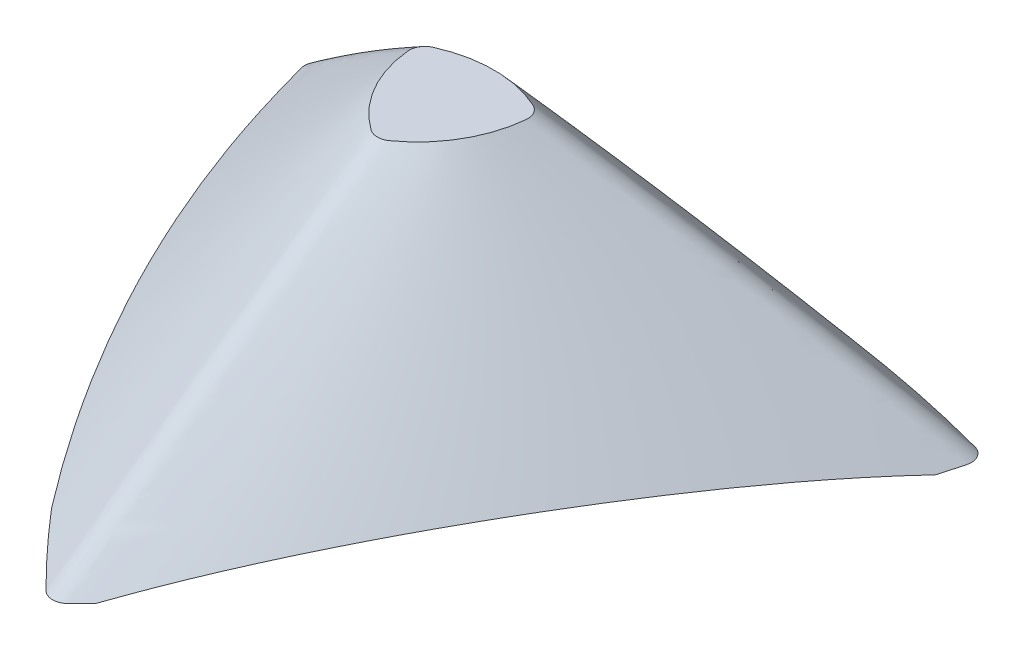
ISO-10303-21;
HEADER;
FILE_DESCRIPTION(('STEP AP214'),'2;1');
FILE_NAME('part.step','',(''),(''),'','','');
FILE_SCHEMA(('AUTOMOTIVE_DESIGN { 1 0 10303 214 1 1 1 1 }'));
ENDSEC;
DATA;
#1=APPLICATION_CONTEXT('core data for automotive mechanical design processes');
#2=APPLICATION_PROTOCOL_DEFINITION('international standard','automotive_design',2000,#1);
#3=PRODUCT_CONTEXT('',#1,'mechanical');
#4=PRODUCT('Part','Part','',(#3));
#5=PRODUCT_RELATED_PRODUCT_CATEGORY('part','',(#4));
#6=PRODUCT_DEFINITION_FORMATION('','',#4);
#7=PRODUCT_DEFINITION_CONTEXT('part definition',#1,'design');
#8=PRODUCT_DEFINITION('design','',#6,#7);
#9=PRODUCT_DEFINITION_SHAPE('','',#8);
#10=(LENGTH_UNIT() NAMED_UNIT(*) SI_UNIT(.MILLI.,.METRE.));
#11=(NAMED_UNIT(*) PLANE_ANGLE_UNIT() SI_UNIT($,.RADIAN.));
#12=(NAMED_UNIT(*) SI_UNIT($,.STERADIAN.) SOLID_ANGLE_UNIT());
#13=UNCERTAINTY_MEASURE_WITH_UNIT(LENGTH_MEASURE(1.E-05),#10,'distance_accuracy_value','');
#14=(GEOMETRIC_REPRESENTATION_CONTEXT(3) GLOBAL_UNCERTAINTY_ASSIGNED_CONTEXT((#13)) GLOBAL_UNIT_ASSIGNED_CONTEXT((#10,
#11,#12)) REPRESENTATION_CONTEXT('',''));
#15=CARTESIAN_POINT('',(0.,0.,0.));
#16=DIRECTION('',(0.,0.,1.));
#17=DIRECTION('',(1.,0.,0.));
#18=AXIS2_PLACEMENT_3D('',#15,#16,#17);
#19=CARTESIAN_POINT('',(7.052802635245,-1.905,-1.07523376713871));
#20=DIRECTION('',(0.,1.,0.));
#21=DIRECTION('',(0.,0.,1.));
#22=AXIS2_PLACEMENT_3D('',#19,#20,#21);
#23=PLANE('',#22);
#24=CARTESIAN_POINT('',(14.10560527049,-1.905,-8.14387499999994));
#25=DIRECTION('',(0.,1.,0.));
#26=DIRECTION('',(0.,0.,1.));
#27=AXIS2_PLACEMENT_3D('',#24,#25,#26);
#28=CIRCLE('',#27,20.22475);
#29=CARTESIAN_POINT('',(-1.2760047758442,-1.905,4.98803636235674));
#30=VERTEX_POINT('',#29);
#31=CARTESIAN_POINT('',(-0.179403564648518,-1.905,6.17321391997653));
#32=VERTEX_POINT('',#31);
#33=EDGE_CURVE('E330',#30,#32,#28,.T.);
#34=ORIENTED_EDGE('',*,*,#33,.F.);
#35=DIRECTION('',(0.866025403784439,0.,0.5));
#36=VECTOR('',#35,1.);
#37=CARTESIAN_POINT('',(-21.0663875340112,-1.90499999999956,-6.43794645915692));
#38=LINE('',#37,#36);
#39=CARTESIAN_POINT('',(0.396255975601761,-1.905,5.95351654863909));
#40=VERTEX_POINT('',#39);
#41=EDGE_CURVE('E275',#30,#40,#38,.T.);
#42=ORIENTED_EDGE('',*,*,#41,.T.);
#43=CARTESIAN_POINT('',(-14.1056052704899,-1.905,-8.14387500000017));
#44=DIRECTION('',(0.,1.,0.));
#45=DIRECTION('',(0.,0.,1.));
#46=AXIS2_PLACEMENT_3D('',#43,#44,#45);
#47=CIRCLE('',#46,20.22475);
#48=CARTESIAN_POINT('',(0.179403564648523,-1.905,6.17321391997653));
#49=VERTEX_POINT('',#48);
#50=EDGE_CURVE('E262',#49,#40,#47,.T.);
#51=ORIENTED_EDGE('',*,*,#50,.F.);
#52=CARTESIAN_POINT('',(0.,-1.905,5.99340746572251));
#53=DIRECTION('',(0.,1.,0.));
#54=DIRECTION('',(0.,0.,1.));
#55=AXIS2_PLACEMENT_3D('',#52,#53,#54);
#56=CIRCLE('',#55,0.254);
#57=EDGE_CURVE('E336',#32,#49,#56,.T.);
#58=ORIENTED_EDGE('',*,*,#57,.F.);
#59=EDGE_LOOP('',(#34,#42,#51,#58));
#60=FACE_BOUND('',#59,.T.);
#61=ADVANCED_FACE('F257',(#60),#23,.F.);
#62=CARTESIAN_POINT('',(5.32697730330674,-1.905,-2.53896031261833));
#63=VERTEX_POINT('',#62);
#64=CARTESIAN_POINT('',(5.4358618600197,-1.905,-2.93123891547317));
#65=VERTEX_POINT('',#64);
#66=EDGE_CURVE('E339',#63,#65,#47,.T.);
#67=ORIENTED_EDGE('',*,*,#66,.F.);
#68=DIRECTION('',(0.866025403784439,0.,0.5));
#69=VECTOR('',#68,1.);
#70=CARTESIAN_POINT('',(-16.1563568506347,-1.90499999999956,-14.9423690694871));
#71=LINE('',#70,#69);
#72=CARTESIAN_POINT('',(3.40565908396037,-1.90499999999996,-3.64823390375689));
#73=VERTEX_POINT('',#72);
#74=EDGE_CURVE('E321',#73,#63,#71,.T.);
#75=ORIENTED_EDGE('',*,*,#74,.F.);
#76=CARTESIAN_POINT('',(-1.36175792864179E-13,-1.905,16.28775));
#77=DIRECTION('',(0.,1.,0.));
#78=DIRECTION('',(0.,0.,1.));
#79=AXIS2_PLACEMENT_3D('',#76,#77,#78);
#80=CIRCLE('',#79,20.22475);
#81=CARTESIAN_POINT('',(5.25645829537112,-1.905,-3.24197500450339));
#82=VERTEX_POINT('',#81);
#83=EDGE_CURVE('E283',#82,#73,#80,.T.);
#84=ORIENTED_EDGE('',*,*,#83,.F.);
#85=CARTESIAN_POINT('',(5.19044312054699,-1.905,-2.99670373286128));
#86=DIRECTION('',(0.,1.,0.));
#87=DIRECTION('',(0.,0.,-1.));
#88=AXIS2_PLACEMENT_3D('',#85,#86,#87);
#89=CIRCLE('',#88,0.254);
#90=EDGE_CURVE('E338',#65,#82,#89,.T.);
#91=ORIENTED_EDGE('',*,*,#90,.F.);
#92=EDGE_LOOP('',(#67,#75,#84,#91));
#93=FACE_BOUND('',#92,.T.);
#94=ADVANCED_FACE('F259',(#93),#23,.F.);
#95=CARTESIAN_POINT('',(-0.137458675349198,1.905,-0.480079690002762));
#96=DIRECTION('',(0.,1.,0.));
#97=DIRECTION('',(0.,0.,1.));
#98=AXIS2_PLACEMENT_3D('',#95,#96,#97);
#99=PLANE('',#98);
#100=CARTESIAN_POINT('',(-0.968981090115898,1.905,-0.55944149321807));
#101=DIRECTION('',(0.,1.,0.));
#102=DIRECTION('',(0.,0.,1.));
#103=AXIS2_PLACEMENT_3D('',#100,#101,#102);
#104=CIRCLE('',#103,1.92460207358788);
#105=CARTESIAN_POINT('',(0.147324848197307,1.905,1.00834490605494));
#106=VERTEX_POINT('',#105);
#107=CARTESIAN_POINT('',(0.94691472852213,1.905,-0.376585391914128));
#108=VERTEX_POINT('',#107);
#109=EDGE_CURVE('E461',#106,#108,#104,.T.);
#110=ORIENTED_EDGE('',*,*,#109,.T.);
#111=CARTESIAN_POINT('',(0.694063739417502,1.905,-0.400717886787454));
#112=DIRECTION('',(0.,1.,0.));
#113=DIRECTION('',(0.,0.,1.));
#114=AXIS2_PLACEMENT_3D('',#111,#112,#113);
#115=CIRCLE('',#114,0.254);
#116=CARTESIAN_POINT('',(0.799611883110579,1.905,-0.631749463580718));
#117=VERTEX_POINT('',#116);
#118=EDGE_CURVE('E464',#108,#117,#115,.T.);
#119=ORIENTED_EDGE('',*,*,#118,.T.);
#120=CARTESIAN_POINT('',(0.,1.905,1.11888298643614));
#121=DIRECTION('',(0.,1.,0.));
#122=DIRECTION('',(0.,0.,1.));
#123=AXIS2_PLACEMENT_3D('',#120,#121,#122);
#124=CIRCLE('',#123,1.92460207358788);
#125=CARTESIAN_POINT('',(-0.799589882568693,1.905,-0.631759513148669));
#126=VERTEX_POINT('',#125);
#127=EDGE_CURVE('E481',#117,#126,#124,.T.);
#128=ORIENTED_EDGE('',*,*,#127,.T.);
#129=CARTESIAN_POINT('',(-0.694063739417501,1.905,-0.400717886787456));
#130=DIRECTION('',(0.,1.,0.));
#131=DIRECTION('',(0.,0.,-1.));
#132=AXIS2_PLACEMENT_3D('',#129,#130,#131);
#133=CIRCLE('',#132,0.254);
#134=CARTESIAN_POINT('',(-0.946914729934934,1.905,-0.376585406716963));
#135=VERTEX_POINT('',#134);
#136=EDGE_CURVE('E488',#126,#135,#133,.T.);
#137=ORIENTED_EDGE('',*,*,#136,.T.);
#138=CARTESIAN_POINT('',(0.9689810901159,1.905,-0.559441493218067));
#139=DIRECTION('',(0.,1.,0.));
#140=DIRECTION('',(0.,0.,1.));
#141=AXIS2_PLACEMENT_3D('',#138,#139,#140);
#142=CIRCLE('',#141,1.92460207358788);
#143=CARTESIAN_POINT('',(-0.147324848197305,1.905,1.00834490605494));
#144=VERTEX_POINT('',#143);
#145=EDGE_CURVE('E501',#135,#144,#142,.T.);
#146=ORIENTED_EDGE('',*,*,#145,.T.);
#147=CARTESIAN_POINT('',(0.,1.905,0.801435773574906));
#148=DIRECTION('',(0.,1.,0.));
#149=DIRECTION('',(0.,0.,-1.));
#150=AXIS2_PLACEMENT_3D('',#147,#148,#149);
#151=CIRCLE('',#150,0.254);
#152=EDGE_CURVE('E408',#144,#106,#151,.T.);
#153=ORIENTED_EDGE('',*,*,#152,.T.);
#154=EDGE_LOOP('',(#110,#119,#128,#137,#146,#153));
#155=FACE_BOUND('',#154,.T.);
#156=ADVANCED_FACE('F359',(#155),#99,.T.);
#157=CARTESIAN_POINT('',(-0.14732484819753,1.905,1.00834490605478));
#158=CARTESIAN_POINT('',(-0.160788691156037,1.27872472014655,1.89380578781215));
#159=CARTESIAN_POINT('',(-0.179526389332494,0.0262563880321568,3.62814631578316));
#160=CARTESIAN_POINT('',(-0.182174502064163,-1.26127527985345,5.33705179715238));
#161=CARTESIAN_POINT('',(-0.179403564559718,-1.905,6.17321392006514));
#162=CARTESIAN_POINT('',(-0.269289760342382,1.905,0.921502619531389));
#163=CARTESIAN_POINT('',(-0.373007909124692,1.26776242938092,1.73277283164838));
#164=CARTESIAN_POINT('',(-0.502722415628321,0.0372228372413951,3.30896504952132));
#165=CARTESIAN_POINT('',(-0.769431419640258,-1.27223757061906,4.75396417924255));
#166=CARTESIAN_POINT('',(-0.774983908624462,-1.905,5.57896808387926));
#167=CARTESIAN_POINT('',(-0.476407161435294,1.905,0.732369141556099));
#168=CARTESIAN_POINT('',(-0.731335945471707,1.28175929044487,1.33182376662411));
#169=CARTESIAN_POINT('',(-1.25142461577985,0.0232206665976648,2.50753673261857));
#170=CARTESIAN_POINT('',(-1.67815689633971,-1.25824070955513,3.7267876479277));
#171=CARTESIAN_POINT('',(-1.93563374546592,-1.905,4.27145942458803));
#172=CARTESIAN_POINT('',(-0.709465281843738,1.905,0.409576770359178));
#173=CARTESIAN_POINT('',(-1.19082918973372,1.27433220073371,0.687487124406752));
#174=CARTESIAN_POINT('',(-2.11037440364625,0.0306505737066125,1.21845229101183));
#175=CARTESIAN_POINT('',(-3.02911247822959,-1.26566779926629,1.74884262229618));
#176=CARTESIAN_POINT('',(-3.46381883877427,-1.905,1.99983673899044));
#177=CARTESIAN_POINT('',(-0.872462373199824,1.905,0.0464242333230209));
#178=CARTESIAN_POINT('',(-1.51901544257042,1.28173537661398,-0.03248407655423));
#179=CARTESIAN_POINT('',(-2.79735150468914,0.0232445895000546,-0.170065527526918));
#180=CARTESIAN_POINT('',(-4.06651979386129,-1.25826462338603,-0.410013810791594));
#181=CARTESIAN_POINT('',(-4.66700924566063,-1.905,-0.459421716298085));
#182=CARTESIAN_POINT('',(-0.932689558339278,1.905,-0.227539536330173));
#183=CARTESIAN_POINT('',(-1.68723621857701,1.26781534375032,-0.543466498650812));
#184=CARTESIAN_POINT('',(-3.11690196883494,0.0371699027994162,-1.21899775207963));
#185=CARTESIAN_POINT('',(-4.50187646693028,-1.27218465624966,-1.71074922174207));
#186=CARTESIAN_POINT('',(-5.21902004185423,-1.905,-2.11832828954667));
#187=CARTESIAN_POINT('',(-0.947575134466371,1.905,-0.383504871099761));
#188=CARTESIAN_POINT('',(-1.72202153544563,1.27923118980316,-0.819920836145582));
#189=CARTESIAN_POINT('',(-3.23716562957452,0.0257497262509748,-1.67900729497906));
#190=CARTESIAN_POINT('',(-4.72291622696329,-1.26076881019684,-2.54789870265566));
#191=CARTESIAN_POINT('',(-5.44592877838087,-1.905,-2.96897842981301));
#192=CARTESIAN_POINT('',(-0.948737031564325,1.905,-0.400526462420822));
#193=CARTESIAN_POINT('',(-1.72479837204637,1.28032115679362,-0.847619026941801));
#194=CARTESIAN_POINT('',(-3.24554985731324,0.0246593457916136,-1.72682223204758));
#195=CARTESIAN_POINT('',(-4.72075672336259,-1.25967884320638,-2.57889995697958));
#196=CARTESIAN_POINT('',(-5.44406278703057,-1.905,-3.00046125992635));
#197=CARTESIAN_POINT('',(-0.946371871734799,1.905,-0.435962906619162));
#198=CARTESIAN_POINT('',(-1.71984635725904,1.28026626294186,-0.887479748156401));
#199=CARTESIAN_POINT('',(-3.23747349483731,0.0247142604668527,-1.77178353461002));
#200=CARTESIAN_POINT('',(-4.71663668108621,-1.25973373705814,-2.63226546150931));
#201=CARTESIAN_POINT('',(-5.44118114779688,-1.905,-3.05233442965534));
#202=CARTESIAN_POINT('',(-0.936267445343544,1.905,-0.48165956660685));
#203=CARTESIAN_POINT('',(-1.70939384960154,1.28042193931932,-0.932496068922986));
#204=CARTESIAN_POINT('',(-3.22664917157806,0.024558525035,-1.81530251259765));
#205=CARTESIAN_POINT('',(-4.70322922604066,-1.25957806068068,-2.66995483085451));
#206=CARTESIAN_POINT('',(-5.42713712022496,-1.905,-3.08806249502803));
#207=CARTESIAN_POINT('',(-0.916529340003874,1.905,-0.529158461171431));
#208=CARTESIAN_POINT('',(-1.69065509318199,1.28014119511168,-0.976085401089634));
#209=CARTESIAN_POINT('',(-3.20866901519555,0.0248393757403587,-1.85249647744274));
#210=CARTESIAN_POINT('',(-4.68787508821392,-1.25985880488832,-2.70653117210022));
#211=CARTESIAN_POINT('',(-5.41226910133945,-1.905,-3.12477502258496));
#212=CARTESIAN_POINT('',(-0.885263143329103,1.905,-0.570001609100449));
#213=CARTESIAN_POINT('',(-1.66231919465501,1.28043968769854,-1.01413210705758));
#214=CARTESIAN_POINT('',(-3.18560050928454,0.0245407699230882,-1.88674862647803));
#215=CARTESIAN_POINT('',(-4.66392030887175,-1.25956031230146,-2.73814021668172));
#216=CARTESIAN_POINT('',(-5.38790912928076,-1.905,-3.15600736842222));
#217=CARTESIAN_POINT('',(-0.850740888107292,1.905,-0.60160062903979));
#218=CARTESIAN_POINT('',(-1.62857595522878,1.28029106141315,-1.04570492993897));
#219=CARTESIAN_POINT('',(-3.15337626949874,0.0246894525884842,-1.9179201154935));
#220=CARTESIAN_POINT('',(-4.63799986857043,-1.25970893858684,-2.76860862404389));
#221=CARTESIAN_POINT('',(-5.3639897308259,-1.905,-3.1860338857573));
#222=CARTESIAN_POINT('',(-0.821234607126503,1.905,-0.621367139635339));
#223=CARTESIAN_POINT('',(-1.59648117232427,1.28032892014929,-1.06991491143593));
#224=CARTESIAN_POINT('',(-3.11833293400408,0.024651579490985,-1.94734847806463));
#225=CARTESIAN_POINT('',(-4.59379361632907,-1.25967107985071,-2.79885048536488));
#226=CARTESIAN_POINT('',(-5.32050706768262,-1.905,-3.21446604340271));
#227=CARTESIAN_POINT('',(-0.80591252808065,1.905,-0.628871702892459));
#228=CARTESIAN_POINT('',(-1.57109012384714,1.27923364636176,-1.08135562266544));
#229=CARTESIAN_POINT('',(-3.07263870180603,0.0257472687604962,-1.96396237599443));
#230=CARTESIAN_POINT('',(-4.56801019520326,-1.26076635363824,-2.81621773059353));
#231=CARTESIAN_POINT('',(-5.29417513269659,-1.905,-3.23182345437198));
#232=CARTESIAN_POINT('',(-0.663399797996897,1.905,-0.693963083201225));
#233=CARTESIAN_POINT('',(-1.31412133663267,1.26776242938093,-1.1894207409387));
#234=CARTESIAN_POINT('',(-2.61428658530615,0.0372228372413898,-2.08985290774665));
#235=CARTESIAN_POINT('',(-3.73233803808517,-1.27223757061906,-3.04332924549965));
#236=CARTESIAN_POINT('',(-4.44403613322983,-1.905,-3.46063979433255));
#237=CARTESIAN_POINT('',(-0.396046700817735,1.905,-0.778765275125853));
#238=CARTESIAN_POINT('',(-0.787725242524499,1.28175929044487,-1.29926739079127));
#239=CARTESIAN_POINT('',(-1.5458782034804,0.0232206665976666,-2.33753387449581));
#240=CARTESIAN_POINT('',(-2.38841432944561,-1.25824070955513,-3.31672032773006));
#241=CARTESIAN_POINT('',(-2.73137550019476,-1.905,-3.81203770828989));
#242=CARTESIAN_POINT('',(2.87529908358152E-05,1.905,-0.819203342359353));
#243=CARTESIAN_POINT('',(3.32803558967007E-05,1.27433220073371,-1.37503189208081));
#244=CARTESIAN_POINT('',(-2.34354924700007E-05,0.0306505737066133,-2.43686399055998));
#245=CARTESIAN_POINT('',(1.41009853029925E-05,-1.26566779926629,-3.49770966821533));
#246=CARTESIAN_POINT('',(0.,-1.905,-3.99967347798082));
#247=CARTESIAN_POINT('',(0.396026621190959,1.905,-0.77878669569862));
#248=CARTESIAN_POINT('',(0.787639756799656,1.28173537661397,-1.29926392372973));
#249=CARTESIAN_POINT('',(1.54595681949086,0.0232445895000508,-2.33754470261194));
#250=CARTESIAN_POINT('',(2.38834227297865,-1.25826462338602,-3.31670254108031));
#251=CARTESIAN_POINT('',(2.7313755001947,-1.905,-3.81203770828986));
#252=CARTESIAN_POINT('',(0.663399797996899,1.905,-0.693963083201218));
#253=CARTESIAN_POINT('',(1.31427390322588,1.26781534375032,-1.18945617814747));
#254=CARTESIAN_POINT('',(2.61413400487458,0.0371699027994294,-2.08981741007696));
#255=CARTESIAN_POINT('',(3.7324905189982,-1.27218465624969,-3.04336477418988));
#256=CARTESIAN_POINT('',(4.44403613322976,-1.905,-3.4606397943325));
#257=CARTESIAN_POINT('',(0.805912528080654,1.905,-0.628871702892456));
#258=CARTESIAN_POINT('',(1.57108304091707,1.27923118980316,-1.081353977487));
#259=CARTESIAN_POINT('',(3.07264578537853,0.0257497262509759,-1.96396402397985));
#260=CARTESIAN_POINT('',(4.56800311625087,-1.26076881019685,-2.81621608116811));
#261=CARTESIAN_POINT('',(5.29417513269655,-1.905,-3.23182345437206));
#262=CARTESIAN_POINT('',(0.821234607126507,1.905,-0.621367139635336));
#263=CARTESIAN_POINT('',(1.59645879608583,1.28032115679362,-1.0699096931273));
#264=CARTESIAN_POINT('',(3.11824684942957,0.024659345791614,-1.94731750965843));
#265=CARTESIAN_POINT('',(4.59377123824423,-1.25967884320638,-2.79884526902838));
#266=CARTESIAN_POINT('',(5.32050706768259,-1.905,-3.21446604340278));
#267=CARTESIAN_POINT('',(0.850740888107296,1.905,-0.601600629039786));
#268=CARTESIAN_POINT('',(1.62850318587718,1.28026626294186,-1.04569076191426));
#269=CARTESIAN_POINT('',(3.15314629839793,0.0247142604668529,-1.91784252330289));
#270=CARTESIAN_POINT('',(4.63792709971454,-1.25973373705814,-2.7685944554875));
#271=CARTESIAN_POINT('',(5.36398973082586,-1.905,-3.18603388575737));
#272=CARTESIAN_POINT('',(0.885263143329106,1.905,-0.570001609100445));
#273=CARTESIAN_POINT('',(1.6622622094172,1.28042193931932,-1.01413046436632));
#274=CARTESIAN_POINT('',(3.18542267725232,0.0245585250349993,-1.88670889538779));
#275=CARTESIAN_POINT('',(4.66386332349733,-1.25957806068068,-2.73813857414535));
#276=CARTESIAN_POINT('',(5.38790912928073,-1.905,-3.1560073684223));
#277=CARTESIAN_POINT('',(0.916529340003876,1.905,-0.529158461171429));
#278=CARTESIAN_POINT('',(1.69064230019774,1.28014119511167,-0.976107559188334));
#279=CARTESIAN_POINT('',(3.20864351748438,0.0248393757403599,-1.85254064077396));
#280=CARTESIAN_POINT('',(4.68786229528023,-1.25985880488833,-2.70655333011134));
#281=CARTESIAN_POINT('',(5.4122691013394,-1.905,-3.12477502258503));
#282=CARTESIAN_POINT('',(0.936267445343546,1.905,-0.481659566606849));
#283=CARTESIAN_POINT('',(1.70942376483281,1.28043968769854,-0.932544598240938));
#284=CARTESIAN_POINT('',(3.22677249572764,0.0245407699230874,-1.81543665411003));
#285=CARTESIAN_POINT('',(4.70325914120609,-1.25956031230145,-2.67000336036822));
#286=CARTESIAN_POINT('',(5.42713712022492,-1.905,-3.0880624950281));
#287=CARTESIAN_POINT('',(0.9463718717348,1.905,-0.43596290661916));
#288=CARTESIAN_POINT('',(1.71989501180417,1.28029106141315,-0.88753568425115));
#289=CARTESIAN_POINT('',(3.23765567719593,0.0246894525884878,-1.77194389933015));
#290=CARTESIAN_POINT('',(4.71668533584393,-1.25970893858685,-2.63232139690892));
#291=CARTESIAN_POINT('',(5.44118114779684,-1.905,-3.05233442965542));
#292=CARTESIAN_POINT('',(0.948737031564326,1.905,-0.40052646242082));
#293=CARTESIAN_POINT('',(1.72481407935343,1.28032892014929,-0.847635796178412));
#294=CARTESIAN_POINT('',(3.24561971902699,0.0246515794909828,-1.72688129927287));
#295=CARTESIAN_POINT('',(4.72077242988494,-1.2596710798507,-2.57891672880129));
#296=CARTESIAN_POINT('',(5.44406278703052,-1.905,-3.00046125992642));
#297=CARTESIAN_POINT('',(0.947575134466372,1.905,-0.383504871099758));
#298=CARTESIAN_POINT('',(1.72202650167698,1.27923364636176,-0.819926147553741));
#299=CARTESIAN_POINT('',(3.23716066059105,0.025747268760495,-1.67900198441803));
#300=CARTESIAN_POINT('',(4.7229211948838,-1.26076635363824,-2.54790400849554));
#301=CARTESIAN_POINT('',(5.44592877838082,-1.905,-2.96897842981308));
#302=CARTESIAN_POINT('',(0.93268955833928,1.905,-0.227539536330171));
#303=CARTESIAN_POINT('',(1.68712924575735,1.26776242938094,-0.543352090709696));
#304=CARTESIAN_POINT('',(3.11700900093446,0.0372228372413843,-1.21911214177467));
#305=CARTESIAN_POINT('',(4.50176945772543,-1.27223757061906,-1.71063493374289));
#306=CARTESIAN_POINT('',(5.21902004185427,-1.905,-2.11832828954671));
#307=CARTESIAN_POINT('',(0.872453862253032,1.905,0.0463961335697477));
#308=CARTESIAN_POINT('',(1.51906118799621,1.28175929044486,-0.0325563758328453));
#309=CARTESIAN_POINT('',(2.79730281926023,0.0232206665976696,-0.17000285812276));
#310=CARTESIAN_POINT('',(4.06657122578529,-1.25824070955513,-0.410067320197624));
#311=CARTESIAN_POINT('',(4.66700924566064,-1.905,-0.459421716298123));
#312=CARTESIAN_POINT('',(0.709436528852905,1.905,0.409626572000172));
#313=CARTESIAN_POINT('',(1.19079590937782,1.27433220073372,0.687544767674067));
#314=CARTESIAN_POINT('',(2.1103978391387,0.0306505737066125,1.21841169954817));
#315=CARTESIAN_POINT('',(3.02909837724426,-1.26566779926629,1.74886704591916));
#316=CARTESIAN_POINT('',(3.46381883877427,-1.905,1.9998367389904));
#317=CARTESIAN_POINT('',(0.476435752008868,1.905,0.732362462375596));
#318=CARTESIAN_POINT('',(0.731375685770759,1.28173537661397,1.33174800028396));
#319=CARTESIAN_POINT('',(1.25139468519822,0.0232445895000525,2.50761023013886));
#320=CARTESIAN_POINT('',(1.67817752088261,-1.25826462338602,3.72671635187195));
#321=CARTESIAN_POINT('',(1.93563374546586,-1.905,4.27145942458798));
#322=CARTESIAN_POINT('',(0.269289760342382,1.905,0.921502619531389));
#323=CARTESIAN_POINT('',(0.372962315351105,1.26781534375033,1.73292267679829));
#324=CARTESIAN_POINT('',(0.502767963960353,0.0371699027994199,3.30881516215663));
#325=CARTESIAN_POINT('',(0.76938594793198,-1.27218465624968,4.75411399593192));
#326=CARTESIAN_POINT('',(0.774983908624394,-1.905,5.5789680838792));
#327=CARTESIAN_POINT('',(0.14166260638572,1.905,1.01237657399221));
#328=CARTESIAN_POINT('',(0.15093849452855,1.27923118980316,1.90127481363259));
#329=CARTESIAN_POINT('',(0.164519844195972,0.0257497262509753,3.64297131895892));
#330=CARTESIAN_POINT('',(0.154913110712378,-1.26076881019684,5.36411478382379));
#331=CARTESIAN_POINT('',(0.151753645684276,-1.905,6.2008018841851));
#332=CARTESIAN_POINT('',(0.127502424437821,1.905,1.02189360205615));
#333=CARTESIAN_POINT('',(0.12833957596053,1.28032115679362,1.9175287200691));
#334=CARTESIAN_POINT('',(0.127303007883636,0.0246593457916132,3.67413974170602));
#335=CARTESIAN_POINT('',(0.126985485118333,-1.25967884320638,5.37774522600799));
#336=CARTESIAN_POINT('',(0.123555719347945,-1.905,6.21492730332916));
#337=CARTESIAN_POINT('',(0.095630983627506,1.905,1.03756353565895));
#338=CARTESIAN_POINT('',(0.0913431713818519,1.28026626294186,1.93317051007066));
#339=CARTESIAN_POINT('',(0.0843271964393656,0.0247142604668521,3.68962605791292));
#340=CARTESIAN_POINT('',(0.0787095813716196,-1.25973373705814,5.40085991699684));
#341=CARTESIAN_POINT('',(0.0771914169709724,-1.905,6.23836831541274));
#342=CARTESIAN_POINT('',(0.0510043020144414,1.905,1.05166117570729));
#343=CARTESIAN_POINT('',(0.0471316401843318,1.28042193931932,1.94662653328931));
#344=CARTESIAN_POINT('',(0.041226494325717,0.0245585250349997,3.70201140798544));
#345=CARTESIAN_POINT('',(0.0393659025432863,-1.25957806068068,5.4080934049999));
#346=CARTESIAN_POINT('',(0.0392279909441954,-1.905,6.24406986345036));
#347=CARTESIAN_POINT('',(0.,1.905,1.05831692234285));
#348=CARTESIAN_POINT('',(1.2792984241598E-05,1.28014119511168,1.95219296027797));
#349=CARTESIAN_POINT('',(2.54977111421458E-05,0.0248393757403593,3.70503711821671));
#350=CARTESIAN_POINT('',(1.27929336442001E-05,-1.25985880488833,5.41308450221159));
#351=CARTESIAN_POINT('',(0.,-1.905,6.24955004517001));
#352=CARTESIAN_POINT('',(-0.0510043020144395,1.905,1.05166117570729));
#353=CARTESIAN_POINT('',(-0.0471045701778109,1.28043968769854,1.94667670529852));
#354=CARTESIAN_POINT('',(-0.0411719864431331,0.0245407699230886,3.70218528058807));
#355=CARTESIAN_POINT('',(-0.0393388323343756,-1.25956031230146,5.40814357704996));
#356=CARTESIAN_POINT('',(-0.0392279909441922,-1.905,6.24406986345035));
#357=CARTESIAN_POINT('',(-0.0956309836275062,1.905,1.03756353565894));
#358=CARTESIAN_POINT('',(-0.09131905657539,1.28029106141315,1.93324061419012));
#359=CARTESIAN_POINT('',(-0.0842794076972189,0.0246894525884872,3.68986401482367));
#360=CARTESIAN_POINT('',(-0.0786854672735182,-1.25970893858685,5.40093002095285));
#361=CARTESIAN_POINT('',(-0.0771914169709682,-1.905,6.23836831541275));
#362=CARTESIAN_POINT('',(-0.127502424437821,1.905,1.02189360205615));
#363=CARTESIAN_POINT('',(-0.128332907029172,1.2803289201493,1.91755070761435));
#364=CARTESIAN_POINT('',(-0.127286785022932,0.0246515794909808,3.67422977733752));
#365=CARTESIAN_POINT('',(-0.126978813555911,-1.2596710798507,5.37776721416619));
#366=CARTESIAN_POINT('',(-0.123555719347942,-1.905,6.21492730332916));
#367=CARTESIAN_POINT('',(-0.14166260638572,1.905,1.01237657399221));
#368=CARTESIAN_POINT('',(-0.150936377829851,1.27923364636177,1.90128177021918));
#369=CARTESIAN_POINT('',(-0.164521958785045,0.0257472687604937,3.64296436041249));
#370=CARTESIAN_POINT('',(-0.154910999680583,-1.26076635363823,5.3641217390891));
#371=CARTESIAN_POINT('',(-0.151753645684274,-1.905,6.20080188418509));
#372=CARTESIAN_POINT('',(-0.14732484819753,1.905,1.00834490605478));
#373=CARTESIAN_POINT('',(-0.160788691156037,1.27872472014655,1.89380578781215));
#374=CARTESIAN_POINT('',(-0.179526389332494,0.0262563880321568,3.62814631578316));
#375=CARTESIAN_POINT('',(-0.182174502064163,-1.26127527985345,5.33705179715238));
#376=CARTESIAN_POINT('',(-0.179403564559718,-1.905,6.17321392006514));
#377=B_SPLINE_SURFACE_WITH_KNOTS('',3,3,((#157,#158,#159,#160,#161),(#162,#163,#164,#165,#166),
(#167,#168,#169,#170,#171),(#172,#173,#174,#175,#176),(#177,#178,#179,#180,#181),(#182,#183,
#184,#185,#186),(#187,#188,#189,#190,#191),(#192,#193,#194,#195,#196),(#197,#198,#199,#200,
#201),(#202,#203,#204,#205,#206),(#207,#208,#209,#210,#211),(#212,#213,#214,#215,#216),(#217,
#218,#219,#220,#221),(#222,#223,#224,#225,#226),(#227,#228,#229,#230,#231),(#232,#233,#234,#235,
#236),(#237,#238,#239,#240,#241),(#242,#243,#244,#245,#246),(#247,#248,#249,#250,#251),(#252,
#253,#254,#255,#256),(#257,#258,#259,#260,#261),(#262,#263,#264,#265,#266),(#267,#268,#269,#270,
#271),(#272,#273,#274,#275,#276),(#277,#278,#279,#280,#281),(#282,#283,#284,#285,#286),(#287,
#288,#289,#290,#291),(#292,#293,#294,#295,#296),(#297,#298,#299,#300,#301),(#302,#303,#304,#305,
#306),(#307,#308,#309,#310,#311),(#312,#313,#314,#315,#316),(#317,#318,#319,#320,#321),(#322,
#323,#324,#325,#326),(#327,#328,#329,#330,#331),(#332,#333,#334,#335,#336),(#337,#338,#339,#340,
#341),(#342,#343,#344,#345,#346),(#347,#348,#349,#350,#351),(#352,#353,#354,#355,#356),(#357,
#358,#359,#360,#361),(#362,#363,#364,#365,#366),(#367,#368,#369,#370,#371),(#372,#373,#374,#375,
#376)),.UNSPECIFIED.,.T.,.F.,.F.,(4,1,1,1,2,1,1,1,1,1,1,1,2,1,1,1,2,1,1,1,1,1,1,1,2,1,1,1,2,1,1,
1,1,1,1,1,4),(4,1,4),(0.,0.0762531979392591,0.152506395878518,0.228759593817777,
0.305012791757036,0.308552859454073,0.312092927151111,0.315632994848148,0.319173062545185,
0.322713130242222,0.326253197939259,0.329793265636296,0.333333333333333,0.409586531272592,
0.485839729211851,0.562092927151111,0.63834612509037,0.641886192787407,0.645426260484444,
0.648966328181481,0.652506395878518,0.656046463575555,0.659586531272592,0.663126598969629,
0.666666666666666,0.742919864605926,0.819173062545185,0.895426260484444,0.971679458423704,
0.975219526120741,0.978759593817778,0.982299661514815,0.985839729211852,0.989379796908889,
0.992919864605926,0.996459932302963,1.),(0.,0.506885390466783,1.),.UNSPECIFIED.);
#378=CARTESIAN_POINT('',(5.32696332186306,-1.905,-2.5389683848086));
#379=CARTESIAN_POINT('',(5.26460980495468,-1.8770536984521,-2.41382245338132));
#380=CARTESIAN_POINT('',(5.2023317474918,-1.85030206251378,-2.2883775956653));
#381=CARTESIAN_POINT('',(5.07776797913048,-1.79919087580055,-2.03700198554125));
#382=CARTESIAN_POINT('',(5.01548226810334,-1.77483137313838,-1.91107122341322));
#383=CARTESIAN_POINT('',(4.8283855053257,-1.70534902584478,-1.53273765998847));
#384=CARTESIAN_POINT('',(4.70332888883625,-1.66381966776217,-1.27978158747025));
#385=CARTESIAN_POINT('',(4.5137185378563,-1.60874689284596,-0.90035813404582));
#386=CARTESIAN_POINT('',(4.45018096162976,-1.59159356774497,-0.773892174870213));
#387=CARTESIAN_POINT('',(4.25818300277823,-1.54374402554838,-0.394683013855088));
#388=CARTESIAN_POINT('',(4.12835340567242,-1.51666359178579,-0.142161165263725));
#389=CARTESIAN_POINT('',(3.86425735291279,-1.47218388477799,0.361658523207546));
#390=CARTESIAN_POINT('',(3.72998748548903,-1.4547922482397,0.612955243244847));
#391=CARTESIAN_POINT('',(3.45660331529041,-1.42976289736173,1.11339288595538));
#392=CARTESIAN_POINT('',(3.31748926103516,-1.42212468340073,1.3625339184048));
#393=CARTESIAN_POINT('',(3.10478057720581,-1.41799745306864,1.73388213981334));
#394=CARTESIAN_POINT('',(3.03322879444225,-1.4178422457705,1.85723106169352));
#395=CARTESIAN_POINT('',(2.88879365663741,-1.41997079305367,2.10312770272098));
#396=CARTESIAN_POINT('',(2.81591028479438,-1.42225457843068,2.22567541173217));
#397=CARTESIAN_POINT('',(2.59536947949253,-1.43276749416223,2.59231053106587));
#398=CARTESIAN_POINT('',(2.44591704101892,-1.44466003439766,2.8352234116518));
#399=CARTESIAN_POINT('',(2.14316320578057,-1.47817862284307,3.31795140632098));
#400=CARTESIAN_POINT('',(1.98986183867383,-1.49980459607361,3.5577665442524));
#401=CARTESIAN_POINT('',(1.75776790471683,-1.53949180845901,3.91511112856038));
#402=CARTESIAN_POINT('',(1.68008118971437,-1.55392092169628,4.03377756090675));
#403=CARTESIAN_POINT('',(1.44610606702039,-1.60082784855527,4.38875147396262));
#404=CARTESIAN_POINT('',(1.2889202294683,-1.63692277839299,4.6240062126869));
#405=CARTESIAN_POINT('',(1.07011707756887,-1.6938075657416,4.94996837616192));
#406=CARTESIAN_POINT('',(1.00858646945906,-1.71053406951015,5.04146738013072));
#407=CARTESIAN_POINT('',(0.885628843372848,-1.7454537192193,5.22425461041504));
#408=CARTESIAN_POINT('',(0.824201823454833,-1.76364683735112,5.31554284069335));
#409=CARTESIAN_POINT('',(0.701521262515703,-1.80151141994272,5.49802549896633));
#410=CARTESIAN_POINT('',(0.640267875697193,-1.82118392523175,5.58921981428538));
#411=CARTESIAN_POINT('',(0.518035926356906,-1.86199390523575,5.77146752967794));
#412=CARTESIAN_POINT('',(0.457057369543494,-1.88313141023155,5.86252092679894));
#413=CARTESIAN_POINT('',(0.39624623853291,-1.905,5.95351092693972));
#414=B_SPLINE_CURVE_WITH_KNOTS('',3,(#378,#379,#380,#381,#382,#383,#384,#385,#386,#387,#388,
#389,#390,#391,#392,#393,#394,#395,#396,#397,#398,#399,#400,#401,#402,#403,#404,#405,#406,#407,
#408,#409,#410,#411,#412,#413),.UNSPECIFIED.,.F.,.F.,(4,2,2,2,2,2,2,2,2,2,2,2,2,2,2,2,2,4),(0.,
0.427740136438414,0.855488874209947,1.71094542934647,2.13862805713324,2.99410349083925,
3.85025225944494,4.70635716987475,5.13413008231142,5.56190839604414,6.41804079247206,
7.27416659397871,7.70185050209791,8.55731605205997,8.89188610237631,9.22644981033214,
9.56125114478542,9.89605940148303),.UNSPECIFIED.);
#415=EDGE_CURVE('E12',#63,#40,#414,.T.);
#416=CARTESIAN_POINT('',(-1.27595332971288,-1.905,4.98806605607449));
#417=CARTESIAN_POINT('',(-1.34735856263961,-1.89549616299657,4.8920372682269));
#418=CARTESIAN_POINT('',(-1.41799960807102,-1.88596046965062,4.79544273879511));
#419=CARTESIAN_POINT('',(-1.55770486958748,-1.86685328323188,4.6011230196701));
#420=CARTESIAN_POINT('',(-1.62676907871811,-1.85728179000143,4.50339782499311));
#421=CARTESIAN_POINT('',(-1.76327676896665,-1.83813027346478,4.30681097635316));
#422=CARTESIAN_POINT('',(-1.83072012652996,-1.82855024956567,4.20794923659725));
#423=CARTESIAN_POINT('',(-1.96394365188096,-1.80941549142356,4.00911082167632));
#424=CARTESIAN_POINT('',(-2.02972382304217,-1.79986075712928,3.90913414877334));
#425=CARTESIAN_POINT('',(-2.22452030679216,-1.7713034208385,3.60767046457424));
#426=CARTESIAN_POINT('',(-2.35105377205094,-1.7523990339448,3.40456163901489));
#427=CARTESIAN_POINT('',(-2.59739370443665,-1.71516479076255,2.99427883247716));
#428=CARTESIAN_POINT('',(-2.71720064859979,-1.69683489377275,2.7871051411836));
#429=CARTESIAN_POINT('',(-2.94967781284127,-1.66107637703589,2.36919882314055));
#430=CARTESIAN_POINT('',(-3.06236046960172,-1.64364619702539,2.15847326008047));
#431=CARTESIAN_POINT('',(-3.28030734400048,-1.60993560617752,1.73314758555513));
#432=CARTESIAN_POINT('',(-3.38557212726417,-1.59365510767479,1.51854777107901));
#433=CARTESIAN_POINT('',(-3.58876317068883,-1.56260973525934,1.08578931145788));
#434=CARTESIAN_POINT('',(-3.68668917004449,-1.54784491520382,0.867630540170014));
#435=CARTESIAN_POINT('',(-3.87527415978553,-1.52018753157952,0.428072430865219));
#436=CARTESIAN_POINT('',(-3.96593319520936,-1.50729495640671,0.206673112942279));
#437=CARTESIAN_POINT('',(-4.09631972226466,-1.4896167133793,-0.127620412460287));
#438=CARTESIAN_POINT('',(-4.13883848818211,-1.48400190893057,-0.239389673091792));
#439=CARTESIAN_POINT('',(-4.22196290250951,-1.47336584406556,-0.463654721591539));
#440=CARTESIAN_POINT('',(-4.26256873697824,-1.46834452585265,-0.576150437586792));
#441=CARTESIAN_POINT('',(-4.34184266897145,-1.45893884215,-0.801846483397442));
#442=CARTESIAN_POINT('',(-4.38051079943302,-1.45455446583113,-0.915046801199223));
#443=CARTESIAN_POINT('',(-4.45595621324613,-1.44646872118623,-1.14211659012405));
#444=CARTESIAN_POINT('',(-4.49273324155104,-1.44276744481423,-1.25598614920986));
#445=CARTESIAN_POINT('',(-4.56699953359095,-1.43586324812095,-1.4922513904181));
#446=CARTESIAN_POINT('',(-4.60436025993124,-1.4327129326453,-1.61468896283926));
#447=CARTESIAN_POINT('',(-4.67725699015317,-1.42730242931373,-1.86009243994372));
#448=CARTESIAN_POINT('',(-4.71279343482413,-1.42504202554553,-1.98305820914656));
#449=CARTESIAN_POINT('',(-4.75963885620069,-1.422626926969,-2.14898956366762));
#450=CARTESIAN_POINT('',(-4.77161549529399,-1.42206105363732,-2.19176223283548));
#451=CARTESIAN_POINT('',(-4.78945536984124,-1.42129778019945,-2.25596278179242));
#452=CARTESIAN_POINT('',(-4.79538187520324,-1.42105758731071,-2.27737254905));
#453=CARTESIAN_POINT('',(-4.80719510183863,-1.42060591871545,-2.320206175977));
#454=CARTESIAN_POINT('',(-4.81308181815075,-1.42039444652954,-2.34163003705119));
#455=CARTESIAN_POINT('',(-4.82481823336384,-1.42000037531893,-2.38449512138874));
#456=CARTESIAN_POINT('',(-4.83066792053964,-1.41981778503968,-2.40593634794253));
#457=CARTESIAN_POINT('',(-4.84232754441351,-1.41948180797752,-2.4488188865131));
#458=CARTESIAN_POINT('',(-4.84813749869312,-1.41932840734726,-2.4702601936397));
#459=CARTESIAN_POINT('',(-4.85682205159919,-1.41912033879677,-2.50241563622677));
#460=CARTESIAN_POINT('',(-4.85970998156883,-1.41905469003,-2.5131261060567));
#461=CARTESIAN_POINT('',(-4.86547780110139,-1.4189307044446,-2.53454999453861));
#462=CARTESIAN_POINT('',(-4.8683576901411,-1.41887236809141,-2.54526341333483));
#463=CARTESIAN_POINT('',(-4.87267301228377,-1.41879030871766,-2.56134578578126));
#464=CARTESIAN_POINT('',(-4.87411207748852,-1.41876384038171,-2.56671376548627));
#465=CARTESIAN_POINT('',(-4.87699002632395,-1.41871275153755,-2.57745003753763));
#466=CARTESIAN_POINT('',(-4.87842890994643,-1.41868813109463,-2.58281832988833));
#467=CARTESIAN_POINT('',(-4.88129738758433,-1.41864071729835,-2.59355629122508));
#468=CARTESIAN_POINT('',(-4.88272698305047,-1.41861792365304,-2.59892595985303));
#469=CARTESIAN_POINT('',(-4.88561023932428,-1.41857426773946,-2.60965903538139));
#470=CARTESIAN_POINT('',(-4.88706389777276,-1.41855340528316,-2.61502244284111));
#471=CARTESIAN_POINT('',(-4.8892111210029,-1.41852045469149,-2.62374874643533));
#472=CARTESIAN_POINT('',(-4.88998268008712,-1.41850806395587,-2.62709176660322));
#473=CARTESIAN_POINT('',(-4.89140806635736,-1.41848367945388,-2.63380251207299));
#474=CARTESIAN_POINT('',(-4.89206187782636,-1.41847168574068,-2.63717024061061));
#475=CARTESIAN_POINT('',(-4.89377593833697,-1.41843634741378,-2.64728664749718));
#476=CARTESIAN_POINT('',(-4.89459800705612,-1.41841351699795,-2.65408266994121));
#477=CARTESIAN_POINT('',(-4.89510366858272,-1.41838078974748,-2.66428960013965));
#478=CARTESIAN_POINT('',(-4.89515197116865,-1.41837016514315,-2.66768324254441));
#479=CARTESIAN_POINT('',(-4.8950491016677,-1.41834963970502,-2.67446849537573));
#480=CARTESIAN_POINT('',(-4.89489775710988,-1.41833973950483,-2.67786010150981));
#481=CARTESIAN_POINT('',(-4.89437982687868,-1.41831151672168,-2.68806092140595));
#482=CARTESIAN_POINT('',(-4.89395012670006,-1.41829477295065,-2.69486622666468));
#483=CARTESIAN_POINT('',(-4.89280767639847,-1.41826557930347,-2.70843341937907));
#484=CARTESIAN_POINT('',(-4.8920959076949,-1.41825311481583,-2.71519537562869));
#485=CARTESIAN_POINT('',(-4.89006196622289,-1.41823263432001,-2.72860887556604));
#486=CARTESIAN_POINT('',(-4.88874237808703,-1.41822459978903,-2.73526076443323));
#487=CARTESIAN_POINT('',(-4.88530426467088,-1.4182134581481,-2.74839071754078));
#488=CARTESIAN_POINT('',(-4.88318134959727,-1.4182103786094,-2.75486761331563));
#489=CARTESIAN_POINT('',(-4.87968520095201,-1.41820982363501,-2.76447184495904));
#490=CARTESIAN_POINT('',(-4.8784654541007,-1.41821032046853,-2.7676602003861));
#491=CARTESIAN_POINT('',(-4.87598092756032,-1.41821268069151,-2.7740194073078));
#492=CARTESIAN_POINT('',(-4.87471614521987,-1.41821454416157,-2.77719025775914));
#493=CARTESIAN_POINT('',(-4.87054939490356,-1.41822269502889,-2.78724586303381));
#494=CARTESIAN_POINT('',(-4.86748647491566,-1.41823160805607,-2.79407041975213));
#495=CARTESIAN_POINT('',(-4.86228197016204,-1.41825003519325,-2.80398228002452));
#496=CARTESIAN_POINT('',(-4.86044759213796,-1.41825701098331,-2.8072289772745));
#497=CARTESIAN_POINT('',(-4.85657013112849,-1.41827261906006,-2.81359563439031));
#498=CARTESIAN_POINT('',(-4.8545269938812,-1.41828125177793,-2.81671556100914));
#499=CARTESIAN_POINT('',(-4.84820797243366,-1.41830945454724,-2.82588477363892));
#500=CARTESIAN_POINT('',(-4.84371941729897,-1.41833140768356,-2.83178476519254));
#501=CARTESIAN_POINT('',(-4.83683830570958,-1.41836911008018,-2.84052753254667));
#502=CARTESIAN_POINT('',(-4.83451583215019,-1.41838249971904,-2.84342873658491));
#503=CARTESIAN_POINT('',(-4.82977792670191,-1.41841078883201,-2.84914717158227));
#504=CARTESIAN_POINT('',(-4.82736265655567,-1.41842568574696,-2.85196453470376));
#505=CARTESIAN_POINT('',(-4.81995932249068,-1.4184720081289,-2.86012397593176));
#506=CARTESIAN_POINT('',(-4.81474536596263,-1.41850546623836,-2.86526808343917));
#507=CARTESIAN_POINT('',(-4.80370246047699,-1.41857673933318,-2.87489006129031));
#508=CARTESIAN_POINT('',(-4.79787073412793,-1.41861457407177,-2.87936468403027));
#509=CARTESIAN_POINT('',(-4.78599131223323,-1.4186942808985,-2.8879441613388));
#510=CARTESIAN_POINT('',(-4.77994443869421,-1.41873613848166,-2.89205024825942));
#511=CARTESIAN_POINT('',(-4.76778836415655,-1.41882451372875,-2.90012760566186));
#512=CARTESIAN_POINT('',(-4.76167969753452,-1.41887100415285,-2.90409949941169));
#513=CARTESIAN_POINT('',(-4.74680002861758,-1.41897961076935,-2.91219217384358));
#514=CARTESIAN_POINT('',(-4.73781574266691,-1.4190418200718,-2.91592945171782));
#515=CARTESIAN_POINT('',(-4.72407422971324,-1.41913507760753,-2.92072751699162));
#516=CARTESIAN_POINT('',(-4.71943392748361,-1.41916625593733,-2.92219569363896));
#517=CARTESIAN_POINT('',(-4.71009445171603,-1.41922883256944,-2.92493481408385));
#518=CARTESIAN_POINT('',(-4.70539529108303,-1.41926023082289,-2.92620580032561));
#519=CARTESIAN_POINT('',(-4.69121445029506,-1.41935716796295,-2.93004641656309));
#520=CARTESIAN_POINT('',(-4.6817356186514,-1.41942491328761,-2.93262048119069));
#521=CARTESIAN_POINT('',(-4.66279743711697,-1.41956598114957,-2.93775088286699));
#522=CARTESIAN_POINT('',(-4.65333809765394,-1.4196392893439,-2.94030724812743));
#523=CARTESIAN_POINT('',(-4.63437396440573,-1.41979199678229,-2.945426651698));
#524=CARTESIAN_POINT('',(-4.62486916555551,-1.41987142298677,-2.94798966505579));
#525=CARTESIAN_POINT('',(-4.60585124836332,-1.42003609857614,-2.95311025070794));
#526=CARTESIAN_POINT('',(-4.59633812871062,-1.42012135182254,-2.95566781821305));
#527=CARTESIAN_POINT('',(-4.56750511432884,-1.4203884520009,-2.96340825451663));
#528=CARTESIAN_POINT('',(-4.54818242327413,-1.42057929913812,-2.96858031772343));
#529=CARTESIAN_POINT('',(-4.50962259335618,-1.42098365463438,-2.97886934173394));
#530=CARTESIAN_POINT('',(-4.49038549220128,-1.42119704905153,-2.98398644803123));
#531=CARTESIAN_POINT('',(-4.45193554232147,-1.42164674629459,-2.99418099171617));
#532=CARTESIAN_POINT('',(-4.43272270693921,-1.42188301015411,-2.99925848118884));
#533=CARTESIAN_POINT('',(-4.37619442852018,-1.4226119399141,-3.01414676941116));
#534=CARTESIAN_POINT('',(-4.33886757997986,-1.42313656299765,-3.02391277461317));
#535=CARTESIAN_POINT('',(-4.26411588794826,-1.42427275158067,-3.04333029004329));
#536=CARTESIAN_POINT('',(-4.22669098711721,-1.42488446719775,-3.05298157073891));
#537=CARTESIAN_POINT('',(-4.15178944944693,-1.42619331534094,-3.07214724978942));
#538=CARTESIAN_POINT('',(-4.11431279680182,-1.42689048667191,-3.08166158375008));
#539=CARTESIAN_POINT('',(-4.03960989378463,-1.42836315675539,-3.10046760770908));
#540=CARTESIAN_POINT('',(-4.00238391937018,-1.42913801596949,-3.10976044372675));
#541=CARTESIAN_POINT('',(-3.92791293070822,-1.43076877405817,-3.12818493461458));
#542=CARTESIAN_POINT('',(-3.89066793431507,-1.43162463364894,-3.1373166650945));
#543=CARTESIAN_POINT('',(-3.81614330829258,-1.43341629046047,-3.15541463693711));
#544=CARTESIAN_POINT('',(-3.77886368215422,-1.43435208034003,-3.16438089340593));
#545=CARTESIAN_POINT('',(-3.68545097778727,-1.43679413664485,-3.18662051392449));
#546=CARTESIAN_POINT('',(-3.62929324266693,-1.43835006109298,-3.19978510141081));
#547=CARTESIAN_POINT('',(-3.51679972943694,-1.44163744930165,-3.22572151818054));
#548=CARTESIAN_POINT('',(-3.46046381023675,-1.44336918369517,-3.23849270125411));
#549=CARTESIAN_POINT('',(-3.34773144151144,-1.44699999108516,-3.26359422537711));
#550=CARTESIAN_POINT('',(-3.29133504174219,-1.44889897232103,-3.2759248030099));
#551=CARTESIAN_POINT('',(-3.17847755341707,-1.45285888192501,-3.30013108870816));
#552=CARTESIAN_POINT('',(-3.1220165065478,-1.45491973540085,-3.31200700339033));
#553=CARTESIAN_POINT('',(-3.0089966388286,-1.45919914558591,-3.33529970827809));
#554=CARTESIAN_POINT('',(-2.9524378044021,-1.46141772625621,-3.34671642831103));
#555=CARTESIAN_POINT('',(-2.83922510353764,-1.46600743492153,-3.36908348668899));
#556=CARTESIAN_POINT('',(-2.78257122321727,-1.46837858751471,-3.38003374935482));
#557=CARTESIAN_POINT('',(-2.49896011436197,-1.48060713474686,-3.43362158350992));
#558=CARTESIAN_POINT('',(-2.27136340925163,-1.49156755607849,-3.47269138529944));
#559=CARTESIAN_POINT('',(-1.81512528694645,-1.51553603399993,-3.54341583148461));
#560=CARTESIAN_POINT('',(-1.58648381070064,-1.52854420775518,-3.57507005132787));
#561=CARTESIAN_POINT('',(-1.16104680401139,-1.55432727765596,-3.62702293350116));
#562=CARTESIAN_POINT('',(-0.964356248341071,-1.56687125079454,-3.64829699625886));
#563=CARTESIAN_POINT('',(-0.57054589701272,-1.59304404981447,-3.685344277922));
#564=CARTESIAN_POINT('',(-0.373426124914164,-1.60667281754271,-3.70111779145439));
#565=CARTESIAN_POINT('',(0.218412757415352,-1.64886003960345,-3.739864097833));
#566=CARTESIAN_POINT('',(0.613642213983095,-1.67872134247225,-3.75426646785141));
#567=CARTESIAN_POINT('',(1.20862701733523,-1.72527222699943,-3.7597307682112));
#568=CARTESIAN_POINT('',(1.40842537995525,-1.74117546237338,-3.75881149072918));
#569=CARTESIAN_POINT('',(1.80787714720468,-1.77335442179056,-3.75152664169046));
#570=CARTESIAN_POINT('',(2.00753056823275,-1.78963009328642,-3.74516183389393));
#571=CARTESIAN_POINT('',(2.30707338756929,-1.81421016764234,-3.73150102586056));
#572=CARTESIAN_POINT('',(2.40706726275709,-1.82244257913938,-3.72625188805986));
#573=CARTESIAN_POINT('',(2.60697134467191,-1.83893261567995,-3.71436886138542));
#574=CARTESIAN_POINT('',(2.70688155162019,-1.84719024065654,-3.70773497618523));
#575=CARTESIAN_POINT('',(2.90667510700631,-1.86371545879435,-3.69307974430601));
#576=CARTESIAN_POINT('',(3.00655837861363,-1.87198305478007,-3.68505735697118));
#577=CARTESIAN_POINT('',(3.20620806504648,-1.88850536617272,-3.6676538478276));
#578=CARTESIAN_POINT('',(3.30597447933413,-1.8967600815204,-3.6582727197892));
#579=CARTESIAN_POINT('',(3.40567466920447,-1.905,-3.64822490561207));
#580=B_SPLINE_CURVE_WITH_KNOTS('',3,(#416,#417,#418,#419,#420,#421,#422,#423,#424,#425,#426,
#427,#428,#429,#430,#431,#432,#433,#434,#435,#436,#437,#438,#439,#440,#441,#442,#443,#444,#445,
#446,#447,#448,#449,#450,#451,#452,#453,#454,#455,#456,#457,#458,#459,#460,#461,#462,#463,#464,
#465,#466,#467,#468,#469,#470,#471,#472,#473,#474,#475,#476,#477,#478,#479,#480,#481,#482,#483,
#484,#485,#486,#487,#488,#489,#490,#491,#492,#493,#494,#495,#496,#497,#498,#499,#500,#501,#502,
#503,#504,#505,#506,#507,#508,#509,#510,#511,#512,#513,#514,#515,#516,#517,#518,#519,#520,#521,
#522,#523,#524,#525,#526,#527,#528,#529,#530,#531,#532,#533,#534,#535,#536,#537,#538,#539,#540,
#541,#542,#543,#544,#545,#546,#547,#548,#549,#550,#551,#552,#553,#554,#555,#556,#557,#558,#559,
#560,#561,#562,#563,#564,#565,#566,#567,#568,#569,#570,#571,#572,#573,#574,#575,#576,#577,#578,
#579),.UNSPECIFIED.,.F.,.F.,(4,2,2,2,2,2,2,2,2,2,2,2,2,2,2,2,2,2,2,2,2,2,2,2,2,2,2,2,2,2,2,2,2,
2,2,2,2,2,2,2,2,2,2,2,2,2,2,2,2,2,2,2,2,2,2,2,2,2,2,2,2,2,2,2,2,2,2,2,2,2,2,2,2,2,2,2,2,2,2,2,2,
4),(0.,0.36012888436898,0.720259356729583,1.08041719467089,1.44057430202821,2.1605657276386,
2.8805060277175,3.59915271632468,4.3177445474808,5.03636190381656,5.75497480603338,
6.11410519558988,6.47320058237455,6.83228986318443,7.19142744682362,7.57555735286682,
7.95959400297089,8.09285793445424,8.1595064477695,8.22616312356278,8.29283994450057,
8.3594850551308,8.39276459243188,8.42604624693183,8.44271904858272,8.45939243900624,
8.47606315939489,8.49273225491136,8.5030224772511,8.51331407211868,8.53379148185511,
8.54396565151499,8.55414861618199,8.57460424488084,8.59498931720959,8.61528849509747,
8.63570023866227,8.64594190033665,8.65618416596533,8.67858661242253,8.68976543624964,
8.70094717316768,8.72316956382653,8.7343185575451,8.74544892966599,8.76736093536674,
8.78937600892768,8.81131448639699,8.83313083269492,8.86214742260979,8.87675157255997,
8.89135257466931,8.9208222789549,8.95021842587411,8.97975247275148,9.00930628482475,
9.06931776048336,9.12903929270864,9.18866080120475,9.30442095623661,9.4203831135396,
9.53639812492482,9.65152622973244,9.76659878273629,9.88166077826027,10.054762288021,
10.2281344224975,10.4014120213142,10.5746099179619,10.7478341823608,10.921086444871,
11.6144890998296,12.3079314433597,12.9025546924275,13.4971460866835,14.6862357885563,
15.2874827035013,15.8886453046781,16.1900462466867,16.4914463891296,16.7930734112166,
17.0947018162666),.UNSPECIFIED.);
#581=EDGE_CURVE('E268',#30,#73,#580,.T.);
#582=ORIENTED_EDGE('',*,*,#415,.F.);
#583=ORIENTED_EDGE('',*,*,#66,.T.);
#584=ORIENTED_EDGE('',*,*,#90,.T.);
#585=ORIENTED_EDGE('',*,*,#83,.T.);
#586=ORIENTED_EDGE('',*,*,#581,.F.);
#587=ORIENTED_EDGE('',*,*,#33,.T.);
#588=ORIENTED_EDGE('',*,*,#57,.T.);
#589=ORIENTED_EDGE('',*,*,#50,.T.);
#590=EDGE_LOOP('',(#582,#583,#584,#585,#586,#587,#588,#589));
#591=FACE_BOUND('',#590,.T.);
#592=ORIENTED_EDGE('',*,*,#109,.F.);
#593=ORIENTED_EDGE('',*,*,#152,.F.);
#594=ORIENTED_EDGE('',*,*,#145,.F.);
#595=ORIENTED_EDGE('',*,*,#136,.F.);
#596=ORIENTED_EDGE('',*,*,#127,.F.);
#597=ORIENTED_EDGE('',*,*,#118,.F.);
#598=EDGE_LOOP('',(#592,#593,#594,#595,#596,#597));
#599=FACE_BOUND('',#598,.T.);
#600=ADVANCED_FACE('F334',(#591,#599),#377,.T.);
#601=CARTESIAN_POINT('',(-18.6113721923233,-26.4242335480753,-10.6901577643222));
#602=DIRECTION('',(0.866025403784439,0.,0.5));
#603=DIRECTION('',(0.5,0.,-0.866025403784439));
#604=AXIS2_PLACEMENT_3D('',#601,#602,#603);
#605=CYLINDRICAL_SURFACE('',#604,25.0060235762662);
#606=ORIENTED_EDGE('',*,*,#415,.T.);
#607=ORIENTED_EDGE('',*,*,#41,.F.);
#608=ORIENTED_EDGE('',*,*,#581,.T.);
#609=ORIENTED_EDGE('',*,*,#74,.T.);
#610=EDGE_LOOP('',(#606,#607,#608,#609));
#611=FACE_BOUND('',#610,.T.);
#612=ADVANCED_FACE('F320',(#611),#605,.F.);
#613=CLOSED_SHELL('',(#61,#94,#156,#600,#612));
#614=MANIFOLD_SOLID_BREP('B2',#613);
#615=ADVANCED_BREP_SHAPE_REPRESENTATION('',(#18,#614),#14);
#616=SHAPE_DEFINITION_REPRESENTATION(#9,#615);
ENDSEC;
END-ISO-10303-21;
